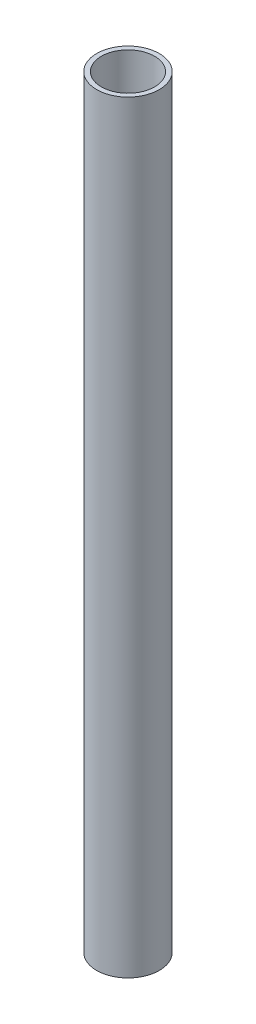
ISO-10303-21;
HEADER;
FILE_DESCRIPTION(('STEP AP214'),'2;1');
FILE_NAME('part.step','',(''),(''),'','','');
FILE_SCHEMA(('AUTOMOTIVE_DESIGN { 1 0 10303 214 1 1 1 1 }'));
ENDSEC;
DATA;
#1=APPLICATION_CONTEXT('core data for automotive mechanical design processes');
#2=APPLICATION_PROTOCOL_DEFINITION('international standard','automotive_design',2000,#1);
#3=PRODUCT_CONTEXT('',#1,'mechanical');
#4=PRODUCT('Part','Part','',(#3));
#5=PRODUCT_RELATED_PRODUCT_CATEGORY('part','',(#4));
#6=PRODUCT_DEFINITION_FORMATION('','',#4);
#7=PRODUCT_DEFINITION_CONTEXT('part definition',#1,'design');
#8=PRODUCT_DEFINITION('design','',#6,#7);
#9=PRODUCT_DEFINITION_SHAPE('','',#8);
#10=(LENGTH_UNIT() NAMED_UNIT(*) SI_UNIT(.MILLI.,.METRE.));
#11=(NAMED_UNIT(*) PLANE_ANGLE_UNIT() SI_UNIT($,.RADIAN.));
#12=(NAMED_UNIT(*) SI_UNIT($,.STERADIAN.) SOLID_ANGLE_UNIT());
#13=UNCERTAINTY_MEASURE_WITH_UNIT(LENGTH_MEASURE(1.E-05),#10,'distance_accuracy_value','');
#14=(GEOMETRIC_REPRESENTATION_CONTEXT(3) GLOBAL_UNCERTAINTY_ASSIGNED_CONTEXT((#13)) GLOBAL_UNIT_ASSIGNED_CONTEXT((#10,
#11,#12)) REPRESENTATION_CONTEXT('',''));
#15=CARTESIAN_POINT('',(0.,0.,0.));
#16=DIRECTION('',(0.,0.,1.));
#17=DIRECTION('',(1.,0.,0.));
#18=AXIS2_PLACEMENT_3D('',#15,#16,#17);
#19=CARTESIAN_POINT('',(0.,390.,0.));
#20=DIRECTION('',(0.,1.,0.));
#21=DIRECTION('',(0.,0.,1.));
#22=AXIS2_PLACEMENT_3D('',#19,#20,#21);
#23=PLANE('',#22);
#24=CARTESIAN_POINT('',(0.,390.,0.));
#25=DIRECTION('',(0.,1.,0.));
#26=DIRECTION('',(0.,0.,1.));
#27=AXIS2_PLACEMENT_3D('',#24,#25,#26);
#28=CIRCLE('',#27,16.);
#29=CARTESIAN_POINT('',(0.,390.,16.));
#30=VERTEX_POINT('',#29);
#31=EDGE_CURVE('E10',#30,#30,#28,.T.);
#32=ORIENTED_EDGE('',*,*,#31,.T.);
#33=EDGE_LOOP('',(#32));
#34=FACE_BOUND('',#33,.T.);
#35=CARTESIAN_POINT('',(0.,390.,0.));
#36=DIRECTION('',(0.,1.,0.));
#37=DIRECTION('',(0.,0.,1.));
#38=AXIS2_PLACEMENT_3D('',#35,#36,#37);
#39=CIRCLE('',#38,13.6);
#40=CARTESIAN_POINT('',(0.,390.,13.6));
#41=VERTEX_POINT('',#40);
#42=EDGE_CURVE('E48',#41,#41,#39,.T.);
#43=ORIENTED_EDGE('',*,*,#42,.F.);
#44=EDGE_LOOP('',(#43));
#45=FACE_BOUND('',#44,.T.);
#46=ADVANCED_FACE('F37',(#34,#45),#23,.T.);
#47=CARTESIAN_POINT('',(0.,0.,0.));
#48=DIRECTION('',(0.,1.,0.));
#49=DIRECTION('',(0.,0.,1.));
#50=AXIS2_PLACEMENT_3D('',#47,#48,#49);
#51=PLANE('',#50);
#52=CARTESIAN_POINT('',(0.,0.,0.));
#53=DIRECTION('',(0.,1.,0.));
#54=DIRECTION('',(0.,0.,1.));
#55=AXIS2_PLACEMENT_3D('',#52,#53,#54);
#56=CIRCLE('',#55,16.);
#57=CARTESIAN_POINT('',(0.,0.,16.));
#58=VERTEX_POINT('',#57);
#59=EDGE_CURVE('E41',#58,#58,#56,.T.);
#60=ORIENTED_EDGE('',*,*,#59,.F.);
#61=EDGE_LOOP('',(#60));
#62=FACE_BOUND('',#61,.T.);
#63=CARTESIAN_POINT('',(0.,0.,0.));
#64=DIRECTION('',(0.,1.,0.));
#65=DIRECTION('',(0.,0.,1.));
#66=AXIS2_PLACEMENT_3D('',#63,#64,#65);
#67=CIRCLE('',#66,13.6);
#68=CARTESIAN_POINT('',(0.,0.,13.6));
#69=VERTEX_POINT('',#68);
#70=EDGE_CURVE('E50',#69,#69,#67,.T.);
#71=ORIENTED_EDGE('',*,*,#70,.T.);
#72=EDGE_LOOP('',(#71));
#73=FACE_BOUND('',#72,.T.);
#74=ADVANCED_FACE('F60',(#62,#73),#51,.F.);
#75=CARTESIAN_POINT('',(0.,390.,0.));
#76=DIRECTION('',(0.,-1.,0.));
#77=DIRECTION('',(0.,0.,-1.));
#78=AXIS2_PLACEMENT_3D('',#75,#76,#77);
#79=CYLINDRICAL_SURFACE('',#78,16.);
#80=ORIENTED_EDGE('',*,*,#31,.F.);
#81=EDGE_LOOP('',(#80));
#82=FACE_BOUND('',#81,.T.);
#83=ORIENTED_EDGE('',*,*,#59,.T.);
#84=EDGE_LOOP('',(#83));
#85=FACE_BOUND('',#84,.T.);
#86=ADVANCED_FACE('F39',(#82,#85),#79,.T.);
#87=CARTESIAN_POINT('',(0.,390.,0.));
#88=DIRECTION('',(0.,-1.,0.));
#89=DIRECTION('',(0.,0.,-1.));
#90=AXIS2_PLACEMENT_3D('',#87,#88,#89);
#91=CYLINDRICAL_SURFACE('',#90,13.6);
#92=ORIENTED_EDGE('',*,*,#42,.T.);
#93=EDGE_LOOP('',(#92));
#94=FACE_BOUND('',#93,.T.);
#95=ORIENTED_EDGE('',*,*,#70,.F.);
#96=EDGE_LOOP('',(#95));
#97=FACE_BOUND('',#96,.T.);
#98=ADVANCED_FACE('F56',(#94,#97),#91,.F.);
#99=CLOSED_SHELL('',(#46,#74,#86,#98));
#100=MANIFOLD_SOLID_BREP('B2',#99);
#101=ADVANCED_BREP_SHAPE_REPRESENTATION('',(#18,#100),#14);
#102=SHAPE_DEFINITION_REPRESENTATION(#9,#101);
ENDSEC;
END-ISO-10303-21;
